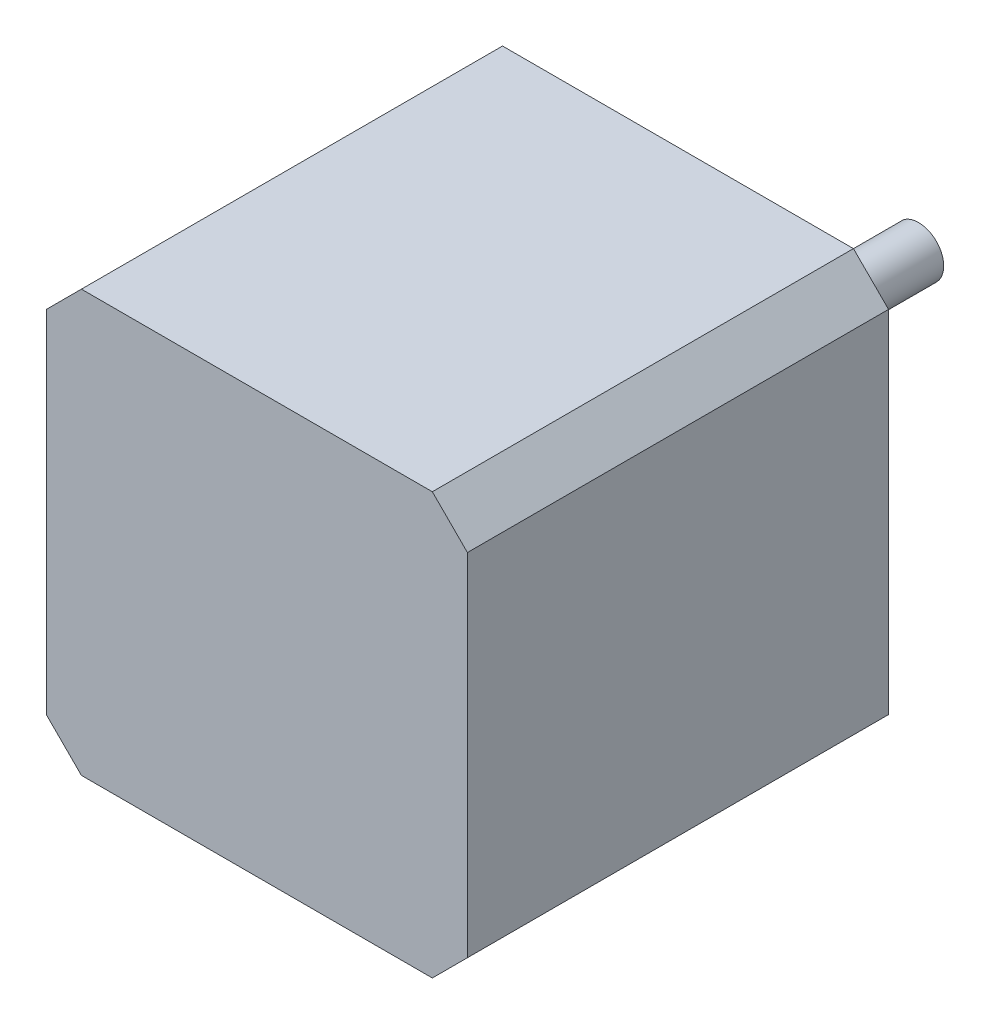
ISO-10303-21;
HEADER;
FILE_DESCRIPTION(('STEP AP214'),'2;1');
FILE_NAME('part.step','',(''),(''),'','','');
FILE_SCHEMA(('AUTOMOTIVE_DESIGN { 1 0 10303 214 1 1 1 1 }'));
ENDSEC;
DATA;
#1=APPLICATION_CONTEXT('core data for automotive mechanical design processes');
#2=APPLICATION_PROTOCOL_DEFINITION('international standard','automotive_design',2000,#1);
#3=PRODUCT_CONTEXT('',#1,'mechanical');
#4=PRODUCT('Part','Part','',(#3));
#5=PRODUCT_RELATED_PRODUCT_CATEGORY('part','',(#4));
#6=PRODUCT_DEFINITION_FORMATION('','',#4);
#7=PRODUCT_DEFINITION_CONTEXT('part definition',#1,'design');
#8=PRODUCT_DEFINITION('design','',#6,#7);
#9=PRODUCT_DEFINITION_SHAPE('','',#8);
#10=(LENGTH_UNIT() NAMED_UNIT(*) SI_UNIT(.MILLI.,.METRE.));
#11=(NAMED_UNIT(*) PLANE_ANGLE_UNIT() SI_UNIT($,.RADIAN.));
#12=(NAMED_UNIT(*) SI_UNIT($,.STERADIAN.) SOLID_ANGLE_UNIT());
#13=UNCERTAINTY_MEASURE_WITH_UNIT(LENGTH_MEASURE(1.E-05),#10,'distance_accuracy_value','');
#14=(GEOMETRIC_REPRESENTATION_CONTEXT(3) GLOBAL_UNCERTAINTY_ASSIGNED_CONTEXT((#13)) GLOBAL_UNIT_ASSIGNED_CONTEXT((#10,
#11,#12)) REPRESENTATION_CONTEXT('',''));
#15=CARTESIAN_POINT('',(0.,0.,0.));
#16=DIRECTION('',(0.,0.,1.));
#17=DIRECTION('',(1.,0.,0.));
#18=AXIS2_PLACEMENT_3D('',#15,#16,#17);
#19=CARTESIAN_POINT('',(0.,0.,0.));
#20=DIRECTION('',(0.,0.,1.));
#21=DIRECTION('',(1.,0.,0.));
#22=AXIS2_PLACEMENT_3D('',#19,#20,#21);
#23=PLANE('',#22);
#24=CARTESIAN_POINT('',(0.,0.,0.));
#25=DIRECTION('',(0.,0.,-1.));
#26=DIRECTION('',(-1.,0.,0.));
#27=AXIS2_PLACEMENT_3D('',#24,#25,#26);
#28=CIRCLE('',#27,5.);
#29=CARTESIAN_POINT('',(-5.,0.,0.));
#30=VERTEX_POINT('',#29);
#31=EDGE_CURVE('E241',#30,#30,#28,.T.);
#32=ORIENTED_EDGE('',*,*,#31,.T.);
#33=EDGE_LOOP('',(#32));
#34=FACE_BOUND('',#33,.T.);
#35=CARTESIAN_POINT('',(0.,0.,0.));
#36=DIRECTION('',(0.,0.,-1.));
#37=DIRECTION('',(-1.,0.,0.));
#38=AXIS2_PLACEMENT_3D('',#35,#36,#37);
#39=CIRCLE('',#38,2.5);
#40=CARTESIAN_POINT('',(-1.5,2.,0.));
#41=VERTEX_POINT('',#40);
#42=CARTESIAN_POINT('',(-1.5,-2.,0.));
#43=VERTEX_POINT('',#42);
#44=EDGE_CURVE('E62',#41,#43,#39,.T.);
#45=ORIENTED_EDGE('',*,*,#44,.F.);
#46=DIRECTION('',(0.,-1.,0.));
#47=VECTOR('',#46,1.);
#48=CARTESIAN_POINT('',(-1.5,0.,0.));
#49=LINE('',#48,#47);
#50=EDGE_CURVE('E259',#41,#43,#49,.T.);
#51=ORIENTED_EDGE('',*,*,#50,.T.);
#52=EDGE_LOOP('',(#45,#51));
#53=FACE_BOUND('',#52,.T.);
#54=ADVANCED_FACE('F47',(#34,#53),#23,.F.);
#55=CARTESIAN_POINT('',(-21.,-17.5,42.));
#56=DIRECTION('',(0.707106781186547,0.707106781186547,0.));
#57=DIRECTION('',(-0.707106781186548,0.707106781186548,0.));
#58=AXIS2_PLACEMENT_3D('',#55,#56,#57);
#59=PLANE('',#58);
#60=DIRECTION('',(0.707106781186547,-0.707106781186547,0.));
#61=VECTOR('',#60,1.);
#62=CARTESIAN_POINT('',(-21.,-17.5,0.));
#63=LINE('',#62,#61);
#64=CARTESIAN_POINT('',(-21.,-17.5,0.));
#65=VERTEX_POINT('',#64);
#66=CARTESIAN_POINT('',(-17.5,-21.,0.));
#67=VERTEX_POINT('',#66);
#68=EDGE_CURVE('E165',#65,#67,#63,.T.);
#69=ORIENTED_EDGE('',*,*,#68,.T.);
#70=DIRECTION('',(0.,0.,-1.));
#71=VECTOR('',#70,1.);
#72=CARTESIAN_POINT('',(-17.5,-21.,42.));
#73=LINE('',#72,#71);
#74=CARTESIAN_POINT('',(-17.5,-21.,42.));
#75=VERTEX_POINT('',#74);
#76=EDGE_CURVE('E56',#75,#67,#73,.T.);
#77=ORIENTED_EDGE('',*,*,#76,.F.);
#78=DIRECTION('',(0.707106781186547,-0.707106781186547,0.));
#79=VECTOR('',#78,1.);
#80=CARTESIAN_POINT('',(-21.,-17.5,42.));
#81=LINE('',#80,#79);
#82=CARTESIAN_POINT('',(-21.,-17.5,42.));
#83=VERTEX_POINT('',#82);
#84=EDGE_CURVE('E192',#83,#75,#81,.T.);
#85=ORIENTED_EDGE('',*,*,#84,.F.);
#86=DIRECTION('',(0.,0.,-1.));
#87=VECTOR('',#86,1.);
#88=CARTESIAN_POINT('',(-21.,-17.5,42.));
#89=LINE('',#88,#87);
#90=EDGE_CURVE('E71',#83,#65,#89,.T.);
#91=ORIENTED_EDGE('',*,*,#90,.T.);
#92=EDGE_LOOP('',(#69,#77,#85,#91));
#93=FACE_BOUND('',#92,.T.);
#94=ADVANCED_FACE('F49',(#93),#59,.F.);
#95=CARTESIAN_POINT('',(-17.5,-21.,42.));
#96=DIRECTION('',(0.,1.,0.));
#97=DIRECTION('',(0.,0.,1.));
#98=AXIS2_PLACEMENT_3D('',#95,#96,#97);
#99=PLANE('',#98);
#100=DIRECTION('',(1.,0.,0.));
#101=VECTOR('',#100,1.);
#102=CARTESIAN_POINT('',(-17.5,-21.,0.));
#103=LINE('',#102,#101);
#104=CARTESIAN_POINT('',(17.5,-21.,0.));
#105=VERTEX_POINT('',#104);
#106=EDGE_CURVE('E168',#67,#105,#103,.T.);
#107=ORIENTED_EDGE('',*,*,#106,.T.);
#108=DIRECTION('',(0.,0.,-1.));
#109=VECTOR('',#108,1.);
#110=CARTESIAN_POINT('',(17.5,-21.,42.));
#111=LINE('',#110,#109);
#112=CARTESIAN_POINT('',(17.5,-21.,42.));
#113=VERTEX_POINT('',#112);
#114=EDGE_CURVE('E206',#113,#105,#111,.T.);
#115=ORIENTED_EDGE('',*,*,#114,.F.);
#116=DIRECTION('',(1.,0.,0.));
#117=VECTOR('',#116,1.);
#118=CARTESIAN_POINT('',(-17.5,-21.,42.));
#119=LINE('',#118,#117);
#120=EDGE_CURVE('E111',#75,#113,#119,.T.);
#121=ORIENTED_EDGE('',*,*,#120,.F.);
#122=ORIENTED_EDGE('',*,*,#76,.T.);
#123=EDGE_LOOP('',(#107,#115,#121,#122));
#124=FACE_BOUND('',#123,.T.);
#125=ADVANCED_FACE('F211',(#124),#99,.F.);
#126=CARTESIAN_POINT('',(17.5,-21.,42.));
#127=DIRECTION('',(-0.707106781186547,0.707106781186547,0.));
#128=DIRECTION('',(-0.707106781186548,-0.707106781186548,0.));
#129=AXIS2_PLACEMENT_3D('',#126,#127,#128);
#130=PLANE('',#129);
#131=DIRECTION('',(0.707106781186547,0.707106781186547,0.));
#132=VECTOR('',#131,1.);
#133=CARTESIAN_POINT('',(17.5,-21.,0.));
#134=LINE('',#133,#132);
#135=CARTESIAN_POINT('',(21.,-17.5,0.));
#136=VERTEX_POINT('',#135);
#137=EDGE_CURVE('E172',#105,#136,#134,.T.);
#138=ORIENTED_EDGE('',*,*,#137,.T.);
#139=DIRECTION('',(0.,0.,-1.));
#140=VECTOR('',#139,1.);
#141=CARTESIAN_POINT('',(21.,-17.5,42.));
#142=LINE('',#141,#140);
#143=CARTESIAN_POINT('',(21.,-17.5,42.));
#144=VERTEX_POINT('',#143);
#145=EDGE_CURVE('E202',#144,#136,#142,.T.);
#146=ORIENTED_EDGE('',*,*,#145,.F.);
#147=DIRECTION('',(0.707106781186547,0.707106781186547,0.));
#148=VECTOR('',#147,1.);
#149=CARTESIAN_POINT('',(17.5,-21.,42.));
#150=LINE('',#149,#148);
#151=EDGE_CURVE('E228',#113,#144,#150,.T.);
#152=ORIENTED_EDGE('',*,*,#151,.F.);
#153=ORIENTED_EDGE('',*,*,#114,.T.);
#154=EDGE_LOOP('',(#138,#146,#152,#153));
#155=FACE_BOUND('',#154,.T.);
#156=ADVANCED_FACE('F227',(#155),#130,.F.);
#157=CARTESIAN_POINT('',(21.,-17.5,42.));
#158=DIRECTION('',(-1.,0.,0.));
#159=DIRECTION('',(0.,0.,1.));
#160=AXIS2_PLACEMENT_3D('',#157,#158,#159);
#161=PLANE('',#160);
#162=DIRECTION('',(0.,1.,0.));
#163=VECTOR('',#162,1.);
#164=CARTESIAN_POINT('',(21.,-17.5,0.));
#165=LINE('',#164,#163);
#166=CARTESIAN_POINT('',(21.,17.5,0.));
#167=VERTEX_POINT('',#166);
#168=EDGE_CURVE('E175',#136,#167,#165,.T.);
#169=ORIENTED_EDGE('',*,*,#168,.T.);
#170=DIRECTION('',(0.,0.,-1.));
#171=VECTOR('',#170,1.);
#172=CARTESIAN_POINT('',(21.,17.5,42.));
#173=LINE('',#172,#171);
#174=CARTESIAN_POINT('',(21.,17.5,42.));
#175=VERTEX_POINT('',#174);
#176=EDGE_CURVE('E199',#175,#167,#173,.T.);
#177=ORIENTED_EDGE('',*,*,#176,.F.);
#178=DIRECTION('',(0.,1.,0.));
#179=VECTOR('',#178,1.);
#180=CARTESIAN_POINT('',(21.,-17.5,42.));
#181=LINE('',#180,#179);
#182=EDGE_CURVE('E159',#144,#175,#181,.T.);
#183=ORIENTED_EDGE('',*,*,#182,.F.);
#184=ORIENTED_EDGE('',*,*,#145,.T.);
#185=EDGE_LOOP('',(#169,#177,#183,#184));
#186=FACE_BOUND('',#185,.T.);
#187=ADVANCED_FACE('F223',(#186),#161,.F.);
#188=CARTESIAN_POINT('',(17.5,21.,42.));
#189=DIRECTION('',(0.707106781186547,0.707106781186547,0.));
#190=DIRECTION('',(-0.707106781186548,0.707106781186548,0.));
#191=AXIS2_PLACEMENT_3D('',#188,#189,#190);
#192=PLANE('',#191);
#193=DIRECTION('',(0.707106781186547,-0.707106781186547,0.));
#194=VECTOR('',#193,1.);
#195=CARTESIAN_POINT('',(17.5,21.,0.));
#196=LINE('',#195,#194);
#197=CARTESIAN_POINT('',(17.5,21.,0.));
#198=VERTEX_POINT('',#197);
#199=EDGE_CURVE('E179',#198,#167,#196,.T.);
#200=ORIENTED_EDGE('',*,*,#199,.F.);
#201=DIRECTION('',(0.,0.,-1.));
#202=VECTOR('',#201,1.);
#203=CARTESIAN_POINT('',(17.5,21.,42.));
#204=LINE('',#203,#202);
#205=CARTESIAN_POINT('',(17.5,21.,42.));
#206=VERTEX_POINT('',#205);
#207=EDGE_CURVE('E141',#206,#198,#204,.T.);
#208=ORIENTED_EDGE('',*,*,#207,.F.);
#209=DIRECTION('',(0.707106781186547,-0.707106781186547,0.));
#210=VECTOR('',#209,1.);
#211=CARTESIAN_POINT('',(17.5,21.,42.));
#212=LINE('',#211,#210);
#213=EDGE_CURVE('E155',#206,#175,#212,.T.);
#214=ORIENTED_EDGE('',*,*,#213,.T.);
#215=ORIENTED_EDGE('',*,*,#176,.T.);
#216=EDGE_LOOP('',(#200,#208,#214,#215));
#217=FACE_BOUND('',#216,.T.);
#218=ADVANCED_FACE('F219',(#217),#192,.T.);
#219=CARTESIAN_POINT('',(-17.5,21.,42.));
#220=DIRECTION('',(0.,1.,0.));
#221=DIRECTION('',(0.,0.,1.));
#222=AXIS2_PLACEMENT_3D('',#219,#220,#221);
#223=PLANE('',#222);
#224=DIRECTION('',(1.,0.,0.));
#225=VECTOR('',#224,1.);
#226=CARTESIAN_POINT('',(-17.5,21.,0.));
#227=LINE('',#226,#225);
#228=CARTESIAN_POINT('',(-17.5,21.,0.));
#229=VERTEX_POINT('',#228);
#230=EDGE_CURVE('E136',#229,#198,#227,.T.);
#231=ORIENTED_EDGE('',*,*,#230,.F.);
#232=DIRECTION('',(0.,0.,-1.));
#233=VECTOR('',#232,1.);
#234=CARTESIAN_POINT('',(-17.5,21.,42.));
#235=LINE('',#234,#233);
#236=CARTESIAN_POINT('',(-17.5,21.,42.));
#237=VERTEX_POINT('',#236);
#238=EDGE_CURVE('E130',#237,#229,#235,.T.);
#239=ORIENTED_EDGE('',*,*,#238,.F.);
#240=DIRECTION('',(1.,0.,0.));
#241=VECTOR('',#240,1.);
#242=CARTESIAN_POINT('',(-17.5,21.,42.));
#243=LINE('',#242,#241);
#244=EDGE_CURVE('E134',#237,#206,#243,.T.);
#245=ORIENTED_EDGE('',*,*,#244,.T.);
#246=ORIENTED_EDGE('',*,*,#207,.T.);
#247=EDGE_LOOP('',(#231,#239,#245,#246));
#248=FACE_BOUND('',#247,.T.);
#249=ADVANCED_FACE('F132',(#248),#223,.T.);
#250=CARTESIAN_POINT('',(-17.5,21.,42.));
#251=DIRECTION('',(0.707106781186547,-0.707106781186547,0.));
#252=DIRECTION('',(0.707106781186548,0.707106781186548,0.));
#253=AXIS2_PLACEMENT_3D('',#250,#251,#252);
#254=PLANE('',#253);
#255=DIRECTION('',(-0.707106781186547,-0.707106781186547,0.));
#256=VECTOR('',#255,1.);
#257=CARTESIAN_POINT('',(-17.5,21.,0.));
#258=LINE('',#257,#256);
#259=CARTESIAN_POINT('',(-21.,17.5,0.));
#260=VERTEX_POINT('',#259);
#261=EDGE_CURVE('E185',#229,#260,#258,.T.);
#262=ORIENTED_EDGE('',*,*,#261,.T.);
#263=DIRECTION('',(0.,0.,-1.));
#264=VECTOR('',#263,1.);
#265=CARTESIAN_POINT('',(-21.,17.5,42.));
#266=LINE('',#265,#264);
#267=CARTESIAN_POINT('',(-21.,17.5,42.));
#268=VERTEX_POINT('',#267);
#269=EDGE_CURVE('E142',#268,#260,#266,.T.);
#270=ORIENTED_EDGE('',*,*,#269,.F.);
#271=DIRECTION('',(-0.707106781186547,-0.707106781186547,0.));
#272=VECTOR('',#271,1.);
#273=CARTESIAN_POINT('',(-17.5,21.,42.));
#274=LINE('',#273,#272);
#275=EDGE_CURVE('E145',#237,#268,#274,.T.);
#276=ORIENTED_EDGE('',*,*,#275,.F.);
#277=ORIENTED_EDGE('',*,*,#238,.T.);
#278=EDGE_LOOP('',(#262,#270,#276,#277));
#279=FACE_BOUND('',#278,.T.);
#280=ADVANCED_FACE('F146',(#279),#254,.F.);
#281=CARTESIAN_POINT('',(-21.,-17.5,42.));
#282=DIRECTION('',(-1.,0.,0.));
#283=DIRECTION('',(0.,0.,1.));
#284=AXIS2_PLACEMENT_3D('',#281,#282,#283);
#285=PLANE('',#284);
#286=DIRECTION('',(0.,1.,0.));
#287=VECTOR('',#286,1.);
#288=CARTESIAN_POINT('',(-21.,-17.5,0.));
#289=LINE('',#288,#287);
#290=EDGE_CURVE('E188',#65,#260,#289,.T.);
#291=ORIENTED_EDGE('',*,*,#290,.F.);
#292=ORIENTED_EDGE('',*,*,#90,.F.);
#293=DIRECTION('',(0.,1.,0.));
#294=VECTOR('',#293,1.);
#295=CARTESIAN_POINT('',(-21.,-17.5,42.));
#296=LINE('',#295,#294);
#297=EDGE_CURVE('E150',#83,#268,#296,.T.);
#298=ORIENTED_EDGE('',*,*,#297,.T.);
#299=ORIENTED_EDGE('',*,*,#269,.T.);
#300=EDGE_LOOP('',(#291,#292,#298,#299));
#301=FACE_BOUND('',#300,.T.);
#302=ADVANCED_FACE('F215',(#301),#285,.T.);
#303=CARTESIAN_POINT('',(0.,0.,42.));
#304=DIRECTION('',(0.,0.,1.));
#305=DIRECTION('',(1.,0.,0.));
#306=AXIS2_PLACEMENT_3D('',#303,#304,#305);
#307=PLANE('',#306);
#308=ORIENTED_EDGE('',*,*,#84,.T.);
#309=ORIENTED_EDGE('',*,*,#120,.T.);
#310=ORIENTED_EDGE('',*,*,#151,.T.);
#311=ORIENTED_EDGE('',*,*,#182,.T.);
#312=ORIENTED_EDGE('',*,*,#213,.F.);
#313=ORIENTED_EDGE('',*,*,#244,.F.);
#314=ORIENTED_EDGE('',*,*,#275,.T.);
#315=ORIENTED_EDGE('',*,*,#297,.F.);
#316=EDGE_LOOP('',(#308,#309,#310,#311,#312,#313,#314,#315));
#317=FACE_BOUND('',#316,.T.);
#318=ADVANCED_FACE('F153',(#317),#307,.T.);
#319=CARTESIAN_POINT('',(15.9099025766973,15.9099025766973,0.));
#320=DIRECTION('',(0.,0.,-1.));
#321=DIRECTION('',(-1.,0.,0.));
#322=AXIS2_PLACEMENT_3D('',#319,#320,#321);
#323=CIRCLE('',#322,1.25);
#324=CARTESIAN_POINT('',(14.6599025766973,15.9099025766973,0.));
#325=VERTEX_POINT('',#324);
#326=EDGE_CURVE('E277',#325,#325,#323,.T.);
#327=ORIENTED_EDGE('',*,*,#326,.F.);
#328=EDGE_LOOP('',(#327));
#329=FACE_BOUND('',#328,.T.);
#330=CARTESIAN_POINT('',(-15.9099025766973,15.9099025766973,0.));
#331=DIRECTION('',(0.,0.,-1.));
#332=DIRECTION('',(-1.,0.,0.));
#333=AXIS2_PLACEMENT_3D('',#330,#331,#332);
#334=CIRCLE('',#333,1.25);
#335=CARTESIAN_POINT('',(-17.1599025766973,15.9099025766973,0.));
#336=VERTEX_POINT('',#335);
#337=EDGE_CURVE('E285',#336,#336,#334,.T.);
#338=ORIENTED_EDGE('',*,*,#337,.F.);
#339=EDGE_LOOP('',(#338));
#340=FACE_BOUND('',#339,.T.);
#341=CARTESIAN_POINT('',(-15.9099025766973,-15.9099025766973,0.));
#342=DIRECTION('',(0.,0.,-1.));
#343=DIRECTION('',(-1.,0.,0.));
#344=AXIS2_PLACEMENT_3D('',#341,#342,#343);
#345=CIRCLE('',#344,1.25);
#346=CARTESIAN_POINT('',(-17.1599025766973,-15.9099025766973,0.));
#347=VERTEX_POINT('',#346);
#348=EDGE_CURVE('E293',#347,#347,#345,.T.);
#349=ORIENTED_EDGE('',*,*,#348,.F.);
#350=EDGE_LOOP('',(#349));
#351=FACE_BOUND('',#350,.T.);
#352=CARTESIAN_POINT('',(15.9099025766973,-15.9099025766973,0.));
#353=DIRECTION('',(0.,0.,-1.));
#354=DIRECTION('',(-1.,0.,0.));
#355=AXIS2_PLACEMENT_3D('',#352,#353,#354);
#356=CIRCLE('',#355,1.25);
#357=CARTESIAN_POINT('',(14.6599025766973,-15.9099025766973,0.));
#358=VERTEX_POINT('',#357);
#359=EDGE_CURVE('E269',#358,#358,#356,.T.);
#360=ORIENTED_EDGE('',*,*,#359,.F.);
#361=EDGE_LOOP('',(#360));
#362=FACE_BOUND('',#361,.T.);
#363=CARTESIAN_POINT('',(0.,0.,0.));
#364=DIRECTION('',(0.,0.,1.));
#365=DIRECTION('',(1.,0.,0.));
#366=AXIS2_PLACEMENT_3D('',#363,#364,#365);
#367=CIRCLE('',#366,11.);
#368=CARTESIAN_POINT('',(11.,0.,0.));
#369=VERTEX_POINT('',#368);
#370=EDGE_CURVE('E12',#369,#369,#367,.F.);
#371=ORIENTED_EDGE('',*,*,#370,.F.);
#372=EDGE_LOOP('',(#371));
#373=FACE_BOUND('',#372,.T.);
#374=ORIENTED_EDGE('',*,*,#68,.F.);
#375=ORIENTED_EDGE('',*,*,#290,.T.);
#376=ORIENTED_EDGE('',*,*,#261,.F.);
#377=ORIENTED_EDGE('',*,*,#230,.T.);
#378=ORIENTED_EDGE('',*,*,#199,.T.);
#379=ORIENTED_EDGE('',*,*,#168,.F.);
#380=ORIENTED_EDGE('',*,*,#137,.F.);
#381=ORIENTED_EDGE('',*,*,#106,.F.);
#382=EDGE_LOOP('',(#374,#375,#376,#377,#378,#379,#380,#381));
#383=FACE_BOUND('',#382,.T.);
#384=ADVANCED_FACE('F213',(#329,#340,#351,#362,#373,#383),#23,.F.);
#385=CARTESIAN_POINT('',(0.,0.,-3.));
#386=DIRECTION('',(0.,0.,-1.));
#387=DIRECTION('',(-1.,0.,0.));
#388=AXIS2_PLACEMENT_3D('',#385,#386,#387);
#389=PLANE('',#388);
#390=CARTESIAN_POINT('',(0.,0.,-3.));
#391=DIRECTION('',(0.,0.,-1.));
#392=DIRECTION('',(-1.,0.,0.));
#393=AXIS2_PLACEMENT_3D('',#390,#391,#392);
#394=CIRCLE('',#393,11.);
#395=CARTESIAN_POINT('',(-11.,0.,-3.));
#396=VERTEX_POINT('',#395);
#397=EDGE_CURVE('E169',#396,#396,#394,.T.);
#398=ORIENTED_EDGE('',*,*,#397,.T.);
#399=EDGE_LOOP('',(#398));
#400=FACE_BOUND('',#399,.T.);
#401=CARTESIAN_POINT('',(0.,0.,-3.));
#402=DIRECTION('',(0.,0.,-1.));
#403=DIRECTION('',(-1.,0.,0.));
#404=AXIS2_PLACEMENT_3D('',#401,#402,#403);
#405=CIRCLE('',#404,5.);
#406=CARTESIAN_POINT('',(-5.,0.,-3.));
#407=VERTEX_POINT('',#406);
#408=EDGE_CURVE('E240',#407,#407,#405,.T.);
#409=ORIENTED_EDGE('',*,*,#408,.F.);
#410=EDGE_LOOP('',(#409));
#411=FACE_BOUND('',#410,.T.);
#412=ADVANCED_FACE('F312',(#400,#411),#389,.T.);
#413=CARTESIAN_POINT('',(0.,0.,-3.));
#414=DIRECTION('',(0.,0.,1.));
#415=DIRECTION('',(1.,0.,0.));
#416=AXIS2_PLACEMENT_3D('',#413,#414,#415);
#417=CYLINDRICAL_SURFACE('',#416,11.);
#418=ORIENTED_EDGE('',*,*,#397,.F.);
#419=EDGE_LOOP('',(#418));
#420=FACE_BOUND('',#419,.T.);
#421=ORIENTED_EDGE('',*,*,#370,.T.);
#422=EDGE_LOOP('',(#421));
#423=FACE_BOUND('',#422,.T.);
#424=ADVANCED_FACE('F319',(#420,#423),#417,.T.);
#425=CARTESIAN_POINT('',(0.,0.,-3.));
#426=DIRECTION('',(0.,0.,1.));
#427=DIRECTION('',(1.,0.,0.));
#428=AXIS2_PLACEMENT_3D('',#425,#426,#427);
#429=CYLINDRICAL_SURFACE('',#428,5.);
#430=ORIENTED_EDGE('',*,*,#408,.T.);
#431=EDGE_LOOP('',(#430));
#432=FACE_BOUND('',#431,.T.);
#433=ORIENTED_EDGE('',*,*,#31,.F.);
#434=EDGE_LOOP('',(#433));
#435=FACE_BOUND('',#434,.T.);
#436=ADVANCED_FACE('F321',(#432,#435),#429,.F.);
#437=CARTESIAN_POINT('',(-1.5,0.,-24.));
#438=DIRECTION('',(-1.,0.,0.));
#439=DIRECTION('',(0.,0.,1.));
#440=AXIS2_PLACEMENT_3D('',#437,#438,#439);
#441=PLANE('',#440);
#442=ORIENTED_EDGE('',*,*,#50,.F.);
#443=DIRECTION('',(0.,0.,1.));
#444=VECTOR('',#443,1.);
#445=CARTESIAN_POINT('',(-1.5,2.,-24.));
#446=LINE('',#445,#444);
#447=CARTESIAN_POINT('',(-1.5,2.,-24.));
#448=VERTEX_POINT('',#447);
#449=EDGE_CURVE('E245',#448,#41,#446,.T.);
#450=ORIENTED_EDGE('',*,*,#449,.F.);
#451=DIRECTION('',(0.,-1.,0.));
#452=VECTOR('',#451,1.);
#453=CARTESIAN_POINT('',(-1.5,0.,-24.));
#454=LINE('',#453,#452);
#455=CARTESIAN_POINT('',(-1.5,-2.,-24.));
#456=VERTEX_POINT('',#455);
#457=EDGE_CURVE('E258',#448,#456,#454,.T.);
#458=ORIENTED_EDGE('',*,*,#457,.T.);
#459=DIRECTION('',(0.,0.,1.));
#460=VECTOR('',#459,1.);
#461=CARTESIAN_POINT('',(-1.5,-2.,-24.));
#462=LINE('',#461,#460);
#463=EDGE_CURVE('E251',#456,#43,#462,.T.);
#464=ORIENTED_EDGE('',*,*,#463,.T.);
#465=EDGE_LOOP('',(#442,#450,#458,#464));
#466=FACE_BOUND('',#465,.T.);
#467=ADVANCED_FACE('F328',(#466),#441,.T.);
#468=CARTESIAN_POINT('',(0.,0.,-24.));
#469=DIRECTION('',(0.,0.,1.));
#470=DIRECTION('',(1.,0.,0.));
#471=AXIS2_PLACEMENT_3D('',#468,#469,#470);
#472=CYLINDRICAL_SURFACE('',#471,2.5);
#473=ORIENTED_EDGE('',*,*,#44,.T.);
#474=ORIENTED_EDGE('',*,*,#463,.F.);
#475=CARTESIAN_POINT('',(0.,0.,-24.));
#476=DIRECTION('',(0.,0.,-1.));
#477=DIRECTION('',(-1.,0.,0.));
#478=AXIS2_PLACEMENT_3D('',#475,#476,#477);
#479=CIRCLE('',#478,2.5);
#480=EDGE_CURVE('E255',#448,#456,#479,.T.);
#481=ORIENTED_EDGE('',*,*,#480,.F.);
#482=ORIENTED_EDGE('',*,*,#449,.T.);
#483=EDGE_LOOP('',(#473,#474,#481,#482));
#484=FACE_BOUND('',#483,.T.);
#485=ADVANCED_FACE('F420',(#484),#472,.T.);
#486=CARTESIAN_POINT('',(0.,0.,-24.));
#487=DIRECTION('',(0.,0.,-1.));
#488=DIRECTION('',(-1.,0.,0.));
#489=AXIS2_PLACEMENT_3D('',#486,#487,#488);
#490=PLANE('',#489);
#491=ORIENTED_EDGE('',*,*,#457,.F.);
#492=ORIENTED_EDGE('',*,*,#480,.T.);
#493=EDGE_LOOP('',(#491,#492));
#494=FACE_BOUND('',#493,.T.);
#495=ADVANCED_FACE('F430',(#494),#490,.T.);
#496=CARTESIAN_POINT('',(15.9099025766973,-15.9099025766973,15.));
#497=DIRECTION('',(0.,0.,-1.));
#498=DIRECTION('',(-1.,0.,0.));
#499=AXIS2_PLACEMENT_3D('',#496,#497,#498);
#500=CYLINDRICAL_SURFACE('',#499,1.25);
#501=CARTESIAN_POINT('',(15.9099025766973,-15.9099025766973,15.));
#502=DIRECTION('',(0.,0.,-1.));
#503=DIRECTION('',(-1.,0.,0.));
#504=AXIS2_PLACEMENT_3D('',#501,#502,#503);
#505=CIRCLE('',#504,1.25);
#506=CARTESIAN_POINT('',(14.6599025766973,-15.9099025766973,15.));
#507=VERTEX_POINT('',#506);
#508=EDGE_CURVE('E262',#507,#507,#505,.T.);
#509=ORIENTED_EDGE('',*,*,#508,.F.);
#510=EDGE_LOOP('',(#509));
#511=FACE_BOUND('',#510,.T.);
#512=ORIENTED_EDGE('',*,*,#359,.T.);
#513=EDGE_LOOP('',(#512));
#514=FACE_BOUND('',#513,.T.);
#515=ADVANCED_FACE('F440',(#511,#514),#500,.F.);
#516=CARTESIAN_POINT('',(0.,0.,15.));
#517=DIRECTION('',(0.,0.,-1.));
#518=DIRECTION('',(-1.,0.,0.));
#519=AXIS2_PLACEMENT_3D('',#516,#517,#518);
#520=PLANE('',#519);
#521=ORIENTED_EDGE('',*,*,#508,.T.);
#522=EDGE_LOOP('',(#521));
#523=FACE_BOUND('',#522,.T.);
#524=ADVANCED_FACE('F306',(#523),#520,.T.);
#525=CARTESIAN_POINT('',(-15.9099025766973,-15.9099025766973,15.));
#526=DIRECTION('',(0.,0.,-1.));
#527=DIRECTION('',(-1.,0.,0.));
#528=AXIS2_PLACEMENT_3D('',#525,#526,#527);
#529=CYLINDRICAL_SURFACE('',#528,1.25);
#530=CARTESIAN_POINT('',(-15.9099025766973,-15.9099025766973,15.));
#531=DIRECTION('',(0.,0.,-1.));
#532=DIRECTION('',(-1.,0.,0.));
#533=AXIS2_PLACEMENT_3D('',#530,#531,#532);
#534=CIRCLE('',#533,1.25);
#535=CARTESIAN_POINT('',(-17.1599025766973,-15.9099025766973,15.));
#536=VERTEX_POINT('',#535);
#537=EDGE_CURVE('E273',#536,#536,#534,.T.);
#538=ORIENTED_EDGE('',*,*,#537,.F.);
#539=EDGE_LOOP('',(#538));
#540=FACE_BOUND('',#539,.T.);
#541=ORIENTED_EDGE('',*,*,#348,.T.);
#542=EDGE_LOOP('',(#541));
#543=FACE_BOUND('',#542,.T.);
#544=ADVANCED_FACE('F303',(#540,#543),#529,.F.);
#545=CARTESIAN_POINT('',(0.,0.,15.));
#546=DIRECTION('',(0.,0.,-1.));
#547=DIRECTION('',(-1.,0.,0.));
#548=AXIS2_PLACEMENT_3D('',#545,#546,#547);
#549=PLANE('',#548);
#550=ORIENTED_EDGE('',*,*,#537,.T.);
#551=EDGE_LOOP('',(#550));
#552=FACE_BOUND('',#551,.T.);
#553=ADVANCED_FACE('F301',(#552),#549,.T.);
#554=CARTESIAN_POINT('',(-15.9099025766973,15.9099025766973,15.));
#555=DIRECTION('',(0.,0.,-1.));
#556=DIRECTION('',(-1.,0.,0.));
#557=AXIS2_PLACEMENT_3D('',#554,#555,#556);
#558=CYLINDRICAL_SURFACE('',#557,1.25);
#559=CARTESIAN_POINT('',(-15.9099025766973,15.9099025766973,15.));
#560=DIRECTION('',(0.,0.,-1.));
#561=DIRECTION('',(-1.,0.,0.));
#562=AXIS2_PLACEMENT_3D('',#559,#560,#561);
#563=CIRCLE('',#562,1.25);
#564=CARTESIAN_POINT('',(-17.1599025766973,15.9099025766973,15.));
#565=VERTEX_POINT('',#564);
#566=EDGE_CURVE('E289',#565,#565,#563,.T.);
#567=ORIENTED_EDGE('',*,*,#566,.F.);
#568=EDGE_LOOP('',(#567));
#569=FACE_BOUND('',#568,.T.);
#570=ORIENTED_EDGE('',*,*,#337,.T.);
#571=EDGE_LOOP('',(#570));
#572=FACE_BOUND('',#571,.T.);
#573=ADVANCED_FACE('F467',(#569,#572),#558,.F.);
#574=CARTESIAN_POINT('',(0.,0.,15.));
#575=DIRECTION('',(0.,0.,-1.));
#576=DIRECTION('',(-1.,0.,0.));
#577=AXIS2_PLACEMENT_3D('',#574,#575,#576);
#578=PLANE('',#577);
#579=ORIENTED_EDGE('',*,*,#566,.T.);
#580=EDGE_LOOP('',(#579));
#581=FACE_BOUND('',#580,.T.);
#582=ADVANCED_FACE('F474',(#581),#578,.T.);
#583=CARTESIAN_POINT('',(15.9099025766973,15.9099025766973,15.));
#584=DIRECTION('',(0.,0.,-1.));
#585=DIRECTION('',(-1.,0.,0.));
#586=AXIS2_PLACEMENT_3D('',#583,#584,#585);
#587=CYLINDRICAL_SURFACE('',#586,1.25);
#588=CARTESIAN_POINT('',(15.9099025766973,15.9099025766973,15.));
#589=DIRECTION('',(0.,0.,-1.));
#590=DIRECTION('',(-1.,0.,0.));
#591=AXIS2_PLACEMENT_3D('',#588,#589,#590);
#592=CIRCLE('',#591,1.25);
#593=CARTESIAN_POINT('',(14.6599025766973,15.9099025766973,15.));
#594=VERTEX_POINT('',#593);
#595=EDGE_CURVE('E281',#594,#594,#592,.T.);
#596=ORIENTED_EDGE('',*,*,#595,.F.);
#597=EDGE_LOOP('',(#596));
#598=FACE_BOUND('',#597,.T.);
#599=ORIENTED_EDGE('',*,*,#326,.T.);
#600=EDGE_LOOP('',(#599));
#601=FACE_BOUND('',#600,.T.);
#602=ADVANCED_FACE('F482',(#598,#601),#587,.F.);
#603=CARTESIAN_POINT('',(0.,0.,15.));
#604=DIRECTION('',(0.,0.,-1.));
#605=DIRECTION('',(-1.,0.,0.));
#606=AXIS2_PLACEMENT_3D('',#603,#604,#605);
#607=PLANE('',#606);
#608=ORIENTED_EDGE('',*,*,#595,.T.);
#609=EDGE_LOOP('',(#608));
#610=FACE_BOUND('',#609,.T.);
#611=ADVANCED_FACE('F490',(#610),#607,.T.);
#612=CLOSED_SHELL('',(#54,#94,#125,#156,#187,#218,#249,#280,#302,#318,#384,#412,#424,#436,#467,
#485,#495,#515,#524,#544,#553,#573,#582,#602,#611));
#613=MANIFOLD_SOLID_BREP('B2',#612);
#614=ADVANCED_BREP_SHAPE_REPRESENTATION('',(#18,#613),#14);
#615=SHAPE_DEFINITION_REPRESENTATION(#9,#614);
ENDSEC;
END-ISO-10303-21;
